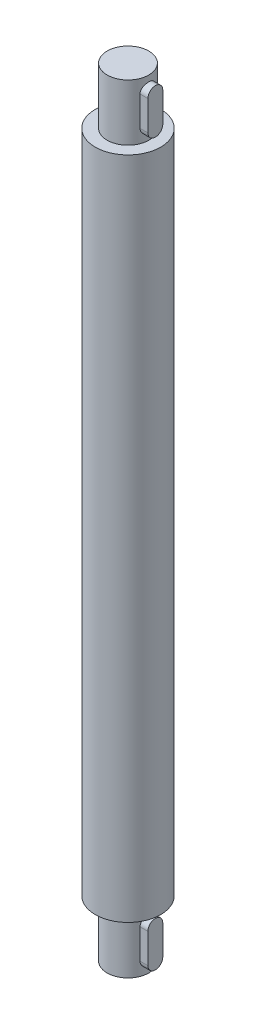
ISO-10303-21;
HEADER;
FILE_DESCRIPTION(('STEP AP214'),'2;1');
FILE_NAME('part.step','',(''),(''),'','','');
FILE_SCHEMA(('AUTOMOTIVE_DESIGN { 1 0 10303 214 1 1 1 1 }'));
ENDSEC;
DATA;
#1=APPLICATION_CONTEXT('core data for automotive mechanical design processes');
#2=APPLICATION_PROTOCOL_DEFINITION('international standard','automotive_design',2000,#1);
#3=PRODUCT_CONTEXT('',#1,'mechanical');
#4=PRODUCT('Part','Part','',(#3));
#5=PRODUCT_RELATED_PRODUCT_CATEGORY('part','',(#4));
#6=PRODUCT_DEFINITION_FORMATION('','',#4);
#7=PRODUCT_DEFINITION_CONTEXT('part definition',#1,'design');
#8=PRODUCT_DEFINITION('design','',#6,#7);
#9=PRODUCT_DEFINITION_SHAPE('','',#8);
#10=(LENGTH_UNIT() NAMED_UNIT(*) SI_UNIT(.MILLI.,.METRE.));
#11=(NAMED_UNIT(*) PLANE_ANGLE_UNIT() SI_UNIT($,.RADIAN.));
#12=(NAMED_UNIT(*) SI_UNIT($,.STERADIAN.) SOLID_ANGLE_UNIT());
#13=UNCERTAINTY_MEASURE_WITH_UNIT(LENGTH_MEASURE(1.E-05),#10,'distance_accuracy_value','');
#14=(GEOMETRIC_REPRESENTATION_CONTEXT(3) GLOBAL_UNCERTAINTY_ASSIGNED_CONTEXT((#13)) GLOBAL_UNIT_ASSIGNED_CONTEXT((#10,
#11,#12)) REPRESENTATION_CONTEXT('',''));
#15=CARTESIAN_POINT('',(0.,0.,0.));
#16=DIRECTION('',(0.,0.,1.));
#17=DIRECTION('',(1.,0.,0.));
#18=AXIS2_PLACEMENT_3D('',#15,#16,#17);
#19=CARTESIAN_POINT('',(0.,261.5,0.));
#20=DIRECTION('',(0.,-1.,0.));
#21=DIRECTION('',(0.,0.,-1.));
#22=AXIS2_PLACEMENT_3D('',#19,#20,#21);
#23=CYLINDRICAL_SURFACE('',#22,7.);
#24=CARTESIAN_POINT('',(0.,242.5,0.));
#25=DIRECTION('',(0.,1.,0.));
#26=DIRECTION('',(0.,0.,1.));
#27=AXIS2_PLACEMENT_3D('',#24,#25,#26);
#28=CIRCLE('',#27,7.);
#29=CARTESIAN_POINT('',(0.,242.5,7.));
#30=VERTEX_POINT('',#29);
#31=EDGE_CURVE('E182',#30,#30,#28,.T.);
#32=ORIENTED_EDGE('',*,*,#31,.T.);
#33=EDGE_LOOP('',(#32));
#34=FACE_BOUND('',#33,.T.);
#35=CARTESIAN_POINT('',(0.,261.5,0.));
#36=DIRECTION('',(0.,1.,0.));
#37=DIRECTION('',(0.,0.,1.));
#38=AXIS2_PLACEMENT_3D('',#35,#36,#37);
#39=CIRCLE('',#38,7.);
#40=CARTESIAN_POINT('',(0.,261.5,7.));
#41=VERTEX_POINT('',#40);
#42=EDGE_CURVE('E169',#41,#41,#39,.T.);
#43=ORIENTED_EDGE('',*,*,#42,.F.);
#44=EDGE_LOOP('',(#43));
#45=FACE_BOUND('',#44,.T.);
#46=CARTESIAN_POINT('',(6.53834841531101,257.,-2.5));
#47=CARTESIAN_POINT('',(6.53834584824662,257.135527062406,-2.50000293142537));
#48=CARTESIAN_POINT('',(6.54260813914497,257.271033863672,-2.48894249442902));
#49=CARTESIAN_POINT('',(6.55909115270697,257.537992919034,-2.44517096849283));
#50=CARTESIAN_POINT('',(6.57131226844034,257.669444972539,-2.41245881021844));
#51=CARTESIAN_POINT('',(6.60215581723148,257.924374759039,-2.32671186637104));
#52=CARTESIAN_POINT('',(6.62076416275495,258.047869336842,-2.27372177606196));
#53=CARTESIAN_POINT('',(6.66226377845015,258.284260868799,-2.14907922668039));
#54=CARTESIAN_POINT('',(6.6851561961377,258.397154971354,-2.07742176541368));
#55=CARTESIAN_POINT('',(6.73379932254783,258.61422119891,-1.91402447589219));
#56=CARTESIAN_POINT('',(6.75962863426195,258.717847862063,-1.82158324114033));
#57=CARTESIAN_POINT('',(6.81057580348322,258.908506848682,-1.62073451198081));
#58=CARTESIAN_POINT('',(6.83569352591561,258.995536039328,-1.51232401016044));
#59=CARTESIAN_POINT('',(6.88331097797525,259.153089086853,-1.27854087761782));
#60=CARTESIAN_POINT('',(6.90570766813104,259.22302949243,-1.1527521877025));
#61=CARTESIAN_POINT('',(6.94442306763788,259.340535055454,-0.890255063415771));
#62=CARTESIAN_POINT('',(6.96074367474991,259.388107200468,-0.753550054798998));
#63=CARTESIAN_POINT('',(6.98491061598651,259.4576409488,-0.478828726649231));
#64=CARTESIAN_POINT('',(6.99306609346167,259.480539560236,-0.341077285205235));
#65=CARTESIAN_POINT('',(7.00108797904843,259.503068389828,-0.063461721247977));
#66=CARTESIAN_POINT('',(7.0009568336799,259.502705475653,0.0764017655190215));
#67=CARTESIAN_POINT('',(6.99262260766838,259.479288802435,0.34759237349461));
#68=CARTESIAN_POINT('',(6.98478254135507,259.457255493618,0.479020651818617));
#69=CARTESIAN_POINT('',(6.96237851891868,259.392827148857,0.736174131701963));
#70=CARTESIAN_POINT('',(6.94781409330091,259.35043069115,0.861898934371431));
#71=CARTESIAN_POINT('',(6.91316507785891,259.245953084174,1.10616096680964));
#72=CARTESIAN_POINT('',(6.89300594264801,259.183604233005,1.22457268185844));
#73=CARTESIAN_POINT('',(6.84923357904068,259.041220859901,1.44953519587019));
#74=CARTESIAN_POINT('',(6.82561929883883,258.961180948701,1.55608236560639));
#75=CARTESIAN_POINT('',(6.77590353640075,258.780669224068,1.76033248031901));
#76=CARTESIAN_POINT('',(6.74973657984374,258.679333098067,1.85725678265595));
#77=CARTESIAN_POINT('',(6.69889962393308,258.461656512569,2.03301110882294));
#78=CARTESIAN_POINT('',(6.67422993264585,258.345312980545,2.11183741816387));
#79=CARTESIAN_POINT('',(6.62879124339514,258.09812234808,2.25045901136822));
#80=CARTESIAN_POINT('',(6.60810276493379,257.967046933587,2.30987563749328));
#81=CARTESIAN_POINT('',(6.57389739465231,257.695820548061,2.40551106572704));
#82=CARTESIAN_POINT('',(6.56037695532893,257.555674104941,2.44174134473283));
#83=CARTESIAN_POINT('',(6.54286005574887,257.277916114231,2.48828716066846));
#84=CARTESIAN_POINT('',(6.53841416370465,257.140538187322,2.49982704691603));
#85=CARTESIAN_POINT('',(6.53828418658321,256.865766624783,2.50016897842258));
#86=CARTESIAN_POINT('',(6.54259819175289,256.728372999106,2.48897597969826));
#87=CARTESIAN_POINT('',(6.55904904907212,256.463426225273,2.44527599545484));
#88=CARTESIAN_POINT('',(6.57085417549386,256.335701256423,2.41367185988824));
#89=CARTESIAN_POINT('',(6.60057618928644,256.087410085006,2.33115923950031));
#90=CARTESIAN_POINT('',(6.61849425677191,255.966845270001,2.28024702700688));
#91=CARTESIAN_POINT('',(6.65919897877473,255.731599822512,2.15854403482726));
#92=CARTESIAN_POINT('',(6.68213439822038,255.617274074217,2.08711845508962));
#93=CARTESIAN_POINT('',(6.7300229745037,255.401792279197,1.92711056207347));
#94=CARTESIAN_POINT('',(6.75497680677527,255.300640670817,1.83852249165401));
#95=CARTESIAN_POINT('',(6.8057956643971,255.108457310004,1.64077043500401));
#96=CARTESIAN_POINT('',(6.83163247928112,255.018320614537,1.53072651663182));
#97=CARTESIAN_POINT('',(6.8799372936983,254.857707314949,1.29643714363473));
#98=CARTESIAN_POINT('',(6.90240534953733,254.787230382215,1.17219192643335));
#99=CARTESIAN_POINT('',(6.94137984159746,254.668499776592,0.913380473926362));
#100=CARTESIAN_POINT('',(6.95791626179403,254.620133982539,0.778870439322916));
#101=CARTESIAN_POINT('',(6.98328335983111,254.546953140943,0.50290689892168));
#102=CARTESIAN_POINT('',(6.99211728252105,254.522128175912,0.361456343526398));
#103=CARTESIAN_POINT('',(7.0008038188261,254.497727033356,0.0837575092860639));
#104=CARTESIAN_POINT('',(7.00111065426498,254.496873893551,-0.0523654499559461));
#105=CARTESIAN_POINT('',(6.99386365091442,254.517215376987,-0.322726803691542));
#106=CARTESIAN_POINT('',(6.98631061639184,254.538407744405,-0.456965389580614));
#107=CARTESIAN_POINT('',(6.96438311073991,254.601360129296,-0.716981322330663));
#108=CARTESIAN_POINT('',(6.95015128080455,254.642690723368,-0.842875555999367));
#109=CARTESIAN_POINT('',(6.91633887698631,254.744333090731,-1.08597143426174));
#110=CARTESIAN_POINT('',(6.89675730094669,254.804648420714,-1.20317144494914));
#111=CARTESIAN_POINT('',(6.85325490485466,254.945311352324,-1.43068233807412));
#112=CARTESIAN_POINT('',(6.82919171160485,255.026364475099,-1.54052934900399));
#113=CARTESIAN_POINT('',(6.77971046047429,255.205052459192,-1.74546847276762));
#114=CARTESIAN_POINT('',(6.75429194159096,255.302692987583,-1.84055552155403));
#115=CARTESIAN_POINT('',(6.70352883842232,255.517218827174,-2.01782220864543));
#116=CARTESIAN_POINT('',(6.67824313001611,255.634789877419,-2.09919180205212));
#117=CARTESIAN_POINT('',(6.63200351602704,255.88273841431,-2.2410079881117));
#118=CARTESIAN_POINT('',(6.61104931825107,256.013115036248,-2.30145599226944));
#119=CARTESIAN_POINT('',(6.57609213229057,256.283740923839,-2.39953333207332));
#120=CARTESIAN_POINT('',(6.56211826403834,256.424028806379,-2.43706721874483));
#121=CARTESIAN_POINT('',(6.54325005921779,256.709553893531,-2.48729274825372));
#122=CARTESIAN_POINT('',(6.53835116581018,256.854788576864,-2.4999968591037));
#123=CARTESIAN_POINT('',(6.53834841531101,257.,-2.5));
#124=B_SPLINE_CURVE_WITH_KNOTS('',3,(#46,#47,#48,#49,#50,#51,#52,#53,#54,#55,#56,#57,#58,#59,
#60,#61,#62,#63,#64,#65,#66,#67,#68,#69,#70,#71,#72,#73,#74,#75,#76,#77,#78,#79,#80,#81,#82,#83,
#84,#85,#86,#87,#88,#89,#90,#91,#92,#93,#94,#95,#96,#97,#98,#99,#100,#101,#102,#103,#104,#105,
#106,#107,#108,#109,#110,#111,#112,#113,#114,#115,#116,#117,#118,#119,#120,#121,#122,#123),
.UNSPECIFIED.,.T.,.F.,(4,2,2,2,2,2,2,2,2,2,2,2,2,2,2,2,2,2,2,2,2,2,2,2,2,2,2,2,2,2,2,2,2,2,2,2,
2,2,4),(0.,0.406041766331056,0.812103587737005,1.2172755024313,1.62255610072686,
2.04441002530116,2.46634349733971,2.90112813694278,3.33577686482081,3.7532646023455,
4.17062908250823,4.56923737347852,4.9678734994849,5.37209971069692,5.77644923231499,
6.20244167773852,6.62852147719011,7.06247609308425,7.49621574141769,7.90789453596193,
8.31948358967597,8.71400941843626,9.10861145427955,9.5170588594573,9.92564351590601,
10.3573204832379,10.7889902346612,11.2184461110407,11.6477209819894,12.0540827015586,
12.4604028439598,12.8584146445104,13.2565010549614,13.6705301611801,14.084701005616,
14.5182116217955,14.9516929848591,15.386967912939,15.8220242160485),.UNSPECIFIED.);
#125=CARTESIAN_POINT('',(6.53834841531101,257.,-2.5));
#126=VERTEX_POINT('',#125);
#127=CARTESIAN_POINT('',(6.53834841531101,257.,2.5));
#128=VERTEX_POINT('',#127);
#129=EDGE_CURVE('E11',#126,#128,#124,.T.);
#130=ORIENTED_EDGE('',*,*,#129,.F.);
#131=DIRECTION('',(0.,-1.,0.));
#132=VECTOR('',#131,1.);
#133=CARTESIAN_POINT('',(6.53834841531101,261.5,-2.5));
#134=LINE('',#133,#132);
#135=CARTESIAN_POINT('',(6.53834841531101,247.,-2.5));
#136=VERTEX_POINT('',#135);
#137=EDGE_CURVE('E57',#136,#126,#134,.F.);
#138=ORIENTED_EDGE('',*,*,#137,.F.);
#139=CARTESIAN_POINT('',(6.53834841531101,247.,-2.5));
#140=CARTESIAN_POINT('',(6.53834584824662,247.135527062406,-2.50000293142537));
#141=CARTESIAN_POINT('',(6.54260813914497,247.271033863671,-2.48894249442903));
#142=CARTESIAN_POINT('',(6.55909115270696,247.537992919034,-2.44517096849285));
#143=CARTESIAN_POINT('',(6.57131226844033,247.669444972538,-2.41245881021846));
#144=CARTESIAN_POINT('',(6.60215581723147,247.924374759039,-2.32671186637107));
#145=CARTESIAN_POINT('',(6.62076416275494,248.047869336842,-2.27372177606199));
#146=CARTESIAN_POINT('',(6.66226377845014,248.284260868799,-2.14907922668042));
#147=CARTESIAN_POINT('',(6.68515619613769,248.397154971354,-2.0774217654137));
#148=CARTESIAN_POINT('',(6.73379932254782,248.61422119891,-1.91402447589222));
#149=CARTESIAN_POINT('',(6.75962863426194,248.717847862063,-1.82158324114036));
#150=CARTESIAN_POINT('',(6.81057580348321,248.908506848682,-1.62073451198085));
#151=CARTESIAN_POINT('',(6.8356935259156,248.995536039328,-1.51232401016049));
#152=CARTESIAN_POINT('',(6.88331097797524,249.153089086853,-1.27854087761788));
#153=CARTESIAN_POINT('',(6.90570766813103,249.22302949243,-1.15275218770256));
#154=CARTESIAN_POINT('',(6.94442306763787,249.340535055454,-0.890255063415846));
#155=CARTESIAN_POINT('',(6.9607436747499,249.388107200468,-0.753550054799079));
#156=CARTESIAN_POINT('',(6.98491061598651,249.4576409488,-0.478828726649319));
#157=CARTESIAN_POINT('',(6.99306609346167,249.480539560235,-0.341077285205325));
#158=CARTESIAN_POINT('',(7.00108797904843,249.503068389828,-0.0634617212480675));
#159=CARTESIAN_POINT('',(7.0009568336799,249.502705475653,0.0764017655189323));
#160=CARTESIAN_POINT('',(6.99262260766838,249.479288802435,0.347592373494527));
#161=CARTESIAN_POINT('',(6.98478254135507,249.457255493618,0.479020651818539));
#162=CARTESIAN_POINT('',(6.96237851891869,249.392827148857,0.73617413170189));
#163=CARTESIAN_POINT('',(6.94781409330092,249.35043069115,0.86189893437136));
#164=CARTESIAN_POINT('',(6.91316507785892,249.245953084174,1.10616096680956));
#165=CARTESIAN_POINT('',(6.89300594264802,249.183604233006,1.22457268185836));
#166=CARTESIAN_POINT('',(6.8492335790407,249.041220859901,1.44953519587011));
#167=CARTESIAN_POINT('',(6.82561929883885,248.961180948701,1.55608236560631));
#168=CARTESIAN_POINT('',(6.77590353640077,248.780669224068,1.76033248031895));
#169=CARTESIAN_POINT('',(6.74973657984375,248.679333098067,1.8572567826559));
#170=CARTESIAN_POINT('',(6.6988996239331,248.461656512569,2.0330111088229));
#171=CARTESIAN_POINT('',(6.67422993264587,248.345312980545,2.11183741816383));
#172=CARTESIAN_POINT('',(6.62879124339515,248.09812234808,2.25045901136818));
#173=CARTESIAN_POINT('',(6.6081027649338,247.967046933587,2.30987563749325));
#174=CARTESIAN_POINT('',(6.57389739465232,247.695820548061,2.40551106572702));
#175=CARTESIAN_POINT('',(6.56037695532894,247.555674104941,2.44174134473281));
#176=CARTESIAN_POINT('',(6.54286005574888,247.277916114231,2.48828716066845));
#177=CARTESIAN_POINT('',(6.53841416370465,247.140538187322,2.49982704691603));
#178=CARTESIAN_POINT('',(6.53828418658321,246.865766624783,2.50016897842259));
#179=CARTESIAN_POINT('',(6.54259819175289,246.728372999106,2.48897597969827));
#180=CARTESIAN_POINT('',(6.55904904907211,246.463426225273,2.44527599545486));
#181=CARTESIAN_POINT('',(6.57085417549385,246.335701256423,2.41367185988827));
#182=CARTESIAN_POINT('',(6.60057618928643,246.087410085006,2.33115923950035));
#183=CARTESIAN_POINT('',(6.6184942567719,245.966845270001,2.28024702700691));
#184=CARTESIAN_POINT('',(6.65919897877472,245.731599822512,2.15854403482729));
#185=CARTESIAN_POINT('',(6.68213439822037,245.617274074217,2.08711845508965));
#186=CARTESIAN_POINT('',(6.73002297450369,245.401792279197,1.92711056207352));
#187=CARTESIAN_POINT('',(6.75497680677526,245.300640670817,1.83852249165407));
#188=CARTESIAN_POINT('',(6.80579566439709,245.108457310004,1.64077043500406));
#189=CARTESIAN_POINT('',(6.83163247928111,245.018320614537,1.53072651663186));
#190=CARTESIAN_POINT('',(6.87993729369829,244.857707314949,1.29643714363478));
#191=CARTESIAN_POINT('',(6.90240534953732,244.787230382215,1.17219192643341));
#192=CARTESIAN_POINT('',(6.94137984159745,244.668499776592,0.913380473926433));
#193=CARTESIAN_POINT('',(6.95791626179403,244.620133982539,0.778870439322982));
#194=CARTESIAN_POINT('',(6.9832833598311,244.546953140943,0.502906898921749));
#195=CARTESIAN_POINT('',(6.99211728252105,244.522128175912,0.361456343526476));
#196=CARTESIAN_POINT('',(7.0008038188261,244.497727033356,0.0837575092861523));
#197=CARTESIAN_POINT('',(7.00111065426498,244.496873893551,-0.0523654499558566));
#198=CARTESIAN_POINT('',(6.99386365091442,244.517215376987,-0.322726803691456));
#199=CARTESIAN_POINT('',(6.98631061639185,244.538407744404,-0.456965389580533));
#200=CARTESIAN_POINT('',(6.96438311073992,244.601360129296,-0.716981322330577));
#201=CARTESIAN_POINT('',(6.95015128080457,244.642690723368,-0.842875555999272));
#202=CARTESIAN_POINT('',(6.91633887698632,244.744333090731,-1.08597143426165));
#203=CARTESIAN_POINT('',(6.8967573009467,244.804648420714,-1.20317144494907));
#204=CARTESIAN_POINT('',(6.85325490485468,244.945311352324,-1.43068233807406));
#205=CARTESIAN_POINT('',(6.82919171160486,245.026364475098,-1.54052934900392));
#206=CARTESIAN_POINT('',(6.77971046047431,245.205052459192,-1.74546847276756));
#207=CARTESIAN_POINT('',(6.75429194159098,245.302692987583,-1.84055552155398));
#208=CARTESIAN_POINT('',(6.70352883842234,245.517218827174,-2.01782220864537));
#209=CARTESIAN_POINT('',(6.67824313001613,245.634789877419,-2.09919180205206));
#210=CARTESIAN_POINT('',(6.63200351602706,245.88273841431,-2.24100798811164));
#211=CARTESIAN_POINT('',(6.61104931825108,246.013115036248,-2.3014559922694));
#212=CARTESIAN_POINT('',(6.57609213229058,246.283740923839,-2.39953333207331));
#213=CARTESIAN_POINT('',(6.56211826403834,246.424028806379,-2.43706721874482));
#214=CARTESIAN_POINT('',(6.54325005921779,246.709553893531,-2.48729274825372));
#215=CARTESIAN_POINT('',(6.53835116581018,246.854788576864,-2.4999968591037));
#216=CARTESIAN_POINT('',(6.53834841531101,247.,-2.5));
#217=B_SPLINE_CURVE_WITH_KNOTS('',3,(#139,#140,#141,#142,#143,#144,#145,#146,#147,#148,#149,
#150,#151,#152,#153,#154,#155,#156,#157,#158,#159,#160,#161,#162,#163,#164,#165,#166,#167,#168,
#169,#170,#171,#172,#173,#174,#175,#176,#177,#178,#179,#180,#181,#182,#183,#184,#185,#186,#187,
#188,#189,#190,#191,#192,#193,#194,#195,#196,#197,#198,#199,#200,#201,#202,#203,#204,#205,#206,
#207,#208,#209,#210,#211,#212,#213,#214,#215,#216),.UNSPECIFIED.,.T.,.F.,(4,2,2,2,2,2,2,2,2,2,2,
2,2,2,2,2,2,2,2,2,2,2,2,2,2,2,2,2,2,2,2,2,2,2,2,2,2,2,4),(0.,0.406041766330971,
0.812103587736946,1.21727550243124,1.6225561007268,2.04441002530115,2.46634349733962,
2.90112813694271,3.33577686482071,3.7532646023454,4.17062908250814,4.56923737347844,
4.96787349948481,5.3720997106968,5.7764492323149,6.20244167773845,6.62852147719,
7.06247609308414,7.49621574141758,7.90789453596189,8.31948358967582,8.71400941843613,
9.1086114542795,9.51705885945718,9.92564351590594,10.3573204832378,10.7889902346611,
11.2184461110406,11.6477209819893,12.0540827015585,12.4604028439596,12.8584146445103,
13.2565010549613,13.67053016118,14.0847010056159,14.5182116217953,14.951692984859,
15.3869679129389,15.8220242160484),.UNSPECIFIED.);
#218=CARTESIAN_POINT('',(6.53834841531101,247.,2.5));
#219=VERTEX_POINT('',#218);
#220=EDGE_CURVE('E244',#219,#136,#217,.T.);
#221=ORIENTED_EDGE('',*,*,#220,.F.);
#222=DIRECTION('',(0.,-1.,0.));
#223=VECTOR('',#222,1.);
#224=CARTESIAN_POINT('',(6.53834841531101,261.5,2.5));
#225=LINE('',#224,#223);
#226=EDGE_CURVE('E241',#128,#219,#225,.T.);
#227=ORIENTED_EDGE('',*,*,#226,.F.);
#228=EDGE_LOOP('',(#130,#138,#221,#227));
#229=FACE_BOUND('',#228,.T.);
#230=ADVANCED_FACE('F42',(#34,#45,#229),#23,.T.);
#231=CARTESIAN_POINT('',(0.,19.,0.));
#232=DIRECTION('',(0.,-1.,0.));
#233=DIRECTION('',(0.,0.,-1.));
#234=AXIS2_PLACEMENT_3D('',#231,#232,#233);
#235=CYLINDRICAL_SURFACE('',#234,7.);
#236=DIRECTION('',(0.,-1.,0.));
#237=VECTOR('',#236,1.);
#238=CARTESIAN_POINT('',(6.53834841531101,19.,-2.5));
#239=LINE('',#238,#237);
#240=CARTESIAN_POINT('',(6.53834841531101,14.5,-2.5));
#241=VERTEX_POINT('',#240);
#242=CARTESIAN_POINT('',(6.53834841531101,4.5,-2.5));
#243=VERTEX_POINT('',#242);
#244=EDGE_CURVE('E186',#241,#243,#239,.T.);
#245=ORIENTED_EDGE('',*,*,#244,.T.);
#246=CARTESIAN_POINT('',(6.53834841531101,4.5,-2.5));
#247=CARTESIAN_POINT('',(6.53834584824662,4.36447293759434,-2.50000293142537));
#248=CARTESIAN_POINT('',(6.54260813914497,4.22896613632854,-2.48894249442902));
#249=CARTESIAN_POINT('',(6.55909115270697,3.96200708096645,-2.44517096849284));
#250=CARTESIAN_POINT('',(6.57131226844033,3.83055502746152,-2.41245881021845));
#251=CARTESIAN_POINT('',(6.60215581723148,3.57562524096083,-2.32671186637106));
#252=CARTESIAN_POINT('',(6.62076416275494,3.45213066315779,-2.27372177606199));
#253=CARTESIAN_POINT('',(6.66226377845014,3.21573913120065,-2.14907922668041));
#254=CARTESIAN_POINT('',(6.68515619613769,3.10284502864644,-2.0774217654137));
#255=CARTESIAN_POINT('',(6.73379932254782,2.88577880109018,-1.91402447589221));
#256=CARTESIAN_POINT('',(6.75962863426194,2.78215213793684,-1.82158324114035));
#257=CARTESIAN_POINT('',(6.81057580348321,2.59149315131818,-1.62073451198083));
#258=CARTESIAN_POINT('',(6.8356935259156,2.50446396067198,-1.51232401016048));
#259=CARTESIAN_POINT('',(6.88331097797524,2.34691091314746,-1.27854087761788));
#260=CARTESIAN_POINT('',(6.90570766813103,2.27697050756982,-1.15275218770255));
#261=CARTESIAN_POINT('',(6.94442306763787,2.15946494454605,-0.890255063415834));
#262=CARTESIAN_POINT('',(6.9607436747499,2.11189279953219,-0.753550054799064));
#263=CARTESIAN_POINT('',(6.98491061598651,2.04235905119993,-0.478828726649302));
#264=CARTESIAN_POINT('',(6.99306609346167,2.01946043976448,-0.341077285205309));
#265=CARTESIAN_POINT('',(7.00108797904843,1.9969316101723,-0.063461721248052));
#266=CARTESIAN_POINT('',(7.0009568336799,1.99729452434681,0.0764017655189463));
#267=CARTESIAN_POINT('',(6.99262260766838,2.0207111975646,0.347592373494542));
#268=CARTESIAN_POINT('',(6.98478254135507,2.0427445063821,0.479020651818556));
#269=CARTESIAN_POINT('',(6.96237851891869,2.1071728511432,0.736174131701907));
#270=CARTESIAN_POINT('',(6.94781409330092,2.14956930884995,0.861898934371374));
#271=CARTESIAN_POINT('',(6.91316507785892,2.25404691582561,1.10616096680958));
#272=CARTESIAN_POINT('',(6.89300594264802,2.31639576699443,1.22457268185839));
#273=CARTESIAN_POINT('',(6.84923357904069,2.4587791400987,1.44953519587014));
#274=CARTESIAN_POINT('',(6.82561929883884,2.53881905129852,1.55608236560633));
#275=CARTESIAN_POINT('',(6.77590353640076,2.71933077593156,1.76033248031897));
#276=CARTESIAN_POINT('',(6.74973657984375,2.82066690193269,1.85725678265592));
#277=CARTESIAN_POINT('',(6.69889962393309,3.03834348743058,2.03301110882291));
#278=CARTESIAN_POINT('',(6.67422993264586,3.15468701945543,2.11183741816384));
#279=CARTESIAN_POINT('',(6.62879124339514,3.40187765191961,2.25045901136819));
#280=CARTESIAN_POINT('',(6.6081027649338,3.53295306641328,2.30987563749326));
#281=CARTESIAN_POINT('',(6.57389739465231,3.804179451939,2.40551106572703));
#282=CARTESIAN_POINT('',(6.56037695532894,3.94432589505924,2.44174134473282));
#283=CARTESIAN_POINT('',(6.54286005574888,4.22208388576867,2.48828716066845));
#284=CARTESIAN_POINT('',(6.53841416370465,4.359461812678,2.49982704691603));
#285=CARTESIAN_POINT('',(6.53828418658321,4.63423337521672,2.50016897842258));
#286=CARTESIAN_POINT('',(6.54259819175289,4.77162700089379,2.48897597969827));
#287=CARTESIAN_POINT('',(6.55904904907211,5.03657377472731,2.44527599545485));
#288=CARTESIAN_POINT('',(6.57085417549385,5.16429874357693,2.41367185988826));
#289=CARTESIAN_POINT('',(6.60057618928644,5.41258991499362,2.33115923950034));
#290=CARTESIAN_POINT('',(6.6184942567719,5.53315472999922,2.2802470270069));
#291=CARTESIAN_POINT('',(6.65919897877472,5.76840017748808,2.15854403482729));
#292=CARTESIAN_POINT('',(6.68213439822037,5.88272592578259,2.08711845508965));
#293=CARTESIAN_POINT('',(6.73002297450369,6.09820772080303,1.92711056207351));
#294=CARTESIAN_POINT('',(6.75497680677526,6.19935932918255,1.83852249165407));
#295=CARTESIAN_POINT('',(6.80579566439709,6.39154268999623,1.64077043500406));
#296=CARTESIAN_POINT('',(6.83163247928111,6.48167938546273,1.53072651663186));
#297=CARTESIAN_POINT('',(6.87993729369829,6.64229268505071,1.29643714363478));
#298=CARTESIAN_POINT('',(6.90240534953732,6.71276961778492,1.1721919264334));
#299=CARTESIAN_POINT('',(6.94137984159745,6.83150022340817,0.913380473926429));
#300=CARTESIAN_POINT('',(6.95791626179403,6.87986601746067,0.778870439322977));
#301=CARTESIAN_POINT('',(6.9832833598311,6.95304685905716,0.502906898921739));
#302=CARTESIAN_POINT('',(6.99211728252105,6.97787182408849,0.361456343526464));
#303=CARTESIAN_POINT('',(7.0008038188261,7.00227296664433,0.0837575092861364));
#304=CARTESIAN_POINT('',(7.00111065426498,7.00312610644893,-0.0523654499558732));
#305=CARTESIAN_POINT('',(6.99386365091442,6.98278462301327,-0.322726803691473));
#306=CARTESIAN_POINT('',(6.98631061639184,6.96159225559553,-0.456965389580549));
#307=CARTESIAN_POINT('',(6.96438311073992,6.89863987070442,-0.716981322330597));
#308=CARTESIAN_POINT('',(6.95015128080456,6.85730927663153,-0.842875555999297));
#309=CARTESIAN_POINT('',(6.91633887698632,6.75566690926909,-1.08597143426168));
#310=CARTESIAN_POINT('',(6.8967573009467,6.69535157928641,-1.20317144494909));
#311=CARTESIAN_POINT('',(6.85325490485467,6.55468864767617,-1.43068233807408));
#312=CARTESIAN_POINT('',(6.82919171160486,6.47363552490154,-1.54052934900393));
#313=CARTESIAN_POINT('',(6.77971046047431,6.29494754080834,-1.74546847276757));
#314=CARTESIAN_POINT('',(6.75429194159098,6.19730701241678,-1.84055552155398));
#315=CARTESIAN_POINT('',(6.70352883842234,5.98278117282576,-2.01782220864538));
#316=CARTESIAN_POINT('',(6.67824313001613,5.86521012258063,-2.09919180205207));
#317=CARTESIAN_POINT('',(6.63200351602705,5.61726158568968,-2.24100798811166));
#318=CARTESIAN_POINT('',(6.61104931825108,5.48688496375221,-2.30145599226941));
#319=CARTESIAN_POINT('',(6.57609213229057,5.21625907616111,-2.39953333207331));
#320=CARTESIAN_POINT('',(6.56211826403834,5.07597119362146,-2.43706721874483));
#321=CARTESIAN_POINT('',(6.54325005921779,4.79044610646854,-2.48729274825372));
#322=CARTESIAN_POINT('',(6.53835116581018,4.64521142313578,-2.4999968591037));
#323=CARTESIAN_POINT('',(6.53834841531101,4.5,-2.5));
#324=B_SPLINE_CURVE_WITH_KNOTS('',3,(#246,#247,#248,#249,#250,#251,#252,#253,#254,#255,#256,
#257,#258,#259,#260,#261,#262,#263,#264,#265,#266,#267,#268,#269,#270,#271,#272,#273,#274,#275,
#276,#277,#278,#279,#280,#281,#282,#283,#284,#285,#286,#287,#288,#289,#290,#291,#292,#293,#294,
#295,#296,#297,#298,#299,#300,#301,#302,#303,#304,#305,#306,#307,#308,#309,#310,#311,#312,#313,
#314,#315,#316,#317,#318,#319,#320,#321,#322,#323),.UNSPECIFIED.,.T.,.F.,(4,2,2,2,2,2,2,2,2,2,2,
2,2,2,2,2,2,2,2,2,2,2,2,2,2,2,2,2,2,2,2,2,2,2,2,2,2,2,4),(0.,0.406041766331,0.812103587736961,
1.21727550243125,1.62255610072681,2.04441002530116,2.46634349733964,2.90112813694272,
3.33577686482073,3.75326460234542,4.17062908250815,4.56923737347846,4.96787349948484,
5.37209971069683,5.77644923231493,6.20244167773848,6.62852147719004,7.06247609308417,
7.4962157414176,7.90789453596191,8.31948358967585,8.71400941843618,9.10861145427952,
9.5170588594572,9.92564351590594,10.3573204832378,10.7889902346612,11.2184461110406,
11.6477209819893,12.0540827015585,12.4604028439597,12.8584146445103,13.2565010549614,
13.67053016118,14.0847010056159,14.5182116217954,14.9516929848591,15.386967912939,
15.8220242160484),.UNSPECIFIED.);
#325=CARTESIAN_POINT('',(6.53834841531101,4.5,2.5));
#326=VERTEX_POINT('',#325);
#327=EDGE_CURVE('E234',#243,#326,#324,.T.);
#328=ORIENTED_EDGE('',*,*,#327,.T.);
#329=DIRECTION('',(0.,-1.,0.));
#330=VECTOR('',#329,1.);
#331=CARTESIAN_POINT('',(6.53834841531101,19.,2.5));
#332=LINE('',#331,#330);
#333=CARTESIAN_POINT('',(6.53834841531101,14.5,2.5));
#334=VERTEX_POINT('',#333);
#335=EDGE_CURVE('E213',#326,#334,#332,.F.);
#336=ORIENTED_EDGE('',*,*,#335,.T.);
#337=CARTESIAN_POINT('',(6.53834841531101,14.5,-2.5));
#338=CARTESIAN_POINT('',(6.53834584824662,14.3644729375943,-2.50000293142537));
#339=CARTESIAN_POINT('',(6.54260813914497,14.2289661363285,-2.48894249442902));
#340=CARTESIAN_POINT('',(6.55909115270697,13.9620070809665,-2.44517096849284));
#341=CARTESIAN_POINT('',(6.57131226844033,13.8305550274615,-2.41245881021845));
#342=CARTESIAN_POINT('',(6.60215581723148,13.5756252409608,-2.32671186637106));
#343=CARTESIAN_POINT('',(6.62076416275494,13.4521306631578,-2.27372177606199));
#344=CARTESIAN_POINT('',(6.66226377845014,13.2157391312006,-2.14907922668041));
#345=CARTESIAN_POINT('',(6.68515619613769,13.1028450286464,-2.0774217654137));
#346=CARTESIAN_POINT('',(6.73379932254782,12.8857788010902,-1.91402447589221));
#347=CARTESIAN_POINT('',(6.75962863426194,12.7821521379368,-1.82158324114035));
#348=CARTESIAN_POINT('',(6.81057580348321,12.5914931513182,-1.62073451198083));
#349=CARTESIAN_POINT('',(6.8356935259156,12.504463960672,-1.51232401016048));
#350=CARTESIAN_POINT('',(6.88331097797524,12.3469109131475,-1.27854087761788));
#351=CARTESIAN_POINT('',(6.90570766813103,12.2769705075698,-1.15275218770255));
#352=CARTESIAN_POINT('',(6.94442306763787,12.1594649445461,-0.890255063415834));
#353=CARTESIAN_POINT('',(6.9607436747499,12.1118927995322,-0.753550054799064));
#354=CARTESIAN_POINT('',(6.98491061598651,12.0423590511999,-0.478828726649303));
#355=CARTESIAN_POINT('',(6.99306609346167,12.0194604397645,-0.341077285205309));
#356=CARTESIAN_POINT('',(7.00108797904843,11.9969316101723,-0.0634617212480525));
#357=CARTESIAN_POINT('',(7.0009568336799,11.9972945243468,0.0764017655189459));
#358=CARTESIAN_POINT('',(6.99262260766838,12.0207111975646,0.347592373494541));
#359=CARTESIAN_POINT('',(6.98478254135507,12.0427445063821,0.479020651818555));
#360=CARTESIAN_POINT('',(6.96237851891869,12.1071728511432,0.736174131701906));
#361=CARTESIAN_POINT('',(6.94781409330092,12.1495693088499,0.861898934371373));
#362=CARTESIAN_POINT('',(6.91316507785892,12.2540469158256,1.10616096680958));
#363=CARTESIAN_POINT('',(6.89300594264802,12.3163957669944,1.22457268185839));
#364=CARTESIAN_POINT('',(6.84923357904069,12.4587791400987,1.44953519587014));
#365=CARTESIAN_POINT('',(6.82561929883884,12.5388190512985,1.55608236560633));
#366=CARTESIAN_POINT('',(6.77590353640076,12.7193307759316,1.76033248031897));
#367=CARTESIAN_POINT('',(6.74973657984375,12.8206669019327,1.85725678265592));
#368=CARTESIAN_POINT('',(6.69889962393309,13.0383434874306,2.03301110882291));
#369=CARTESIAN_POINT('',(6.67422993264586,13.1546870194554,2.11183741816384));
#370=CARTESIAN_POINT('',(6.62879124339515,13.4018776519196,2.25045901136819));
#371=CARTESIAN_POINT('',(6.6081027649338,13.5329530664133,2.30987563749326));
#372=CARTESIAN_POINT('',(6.57389739465231,13.804179451939,2.40551106572703));
#373=CARTESIAN_POINT('',(6.56037695532894,13.9443258950592,2.44174134473282));
#374=CARTESIAN_POINT('',(6.54286005574888,14.2220838857687,2.48828716066845));
#375=CARTESIAN_POINT('',(6.53841416370465,14.359461812678,2.49982704691603));
#376=CARTESIAN_POINT('',(6.53828418658321,14.6342333752167,2.50016897842258));
#377=CARTESIAN_POINT('',(6.54259819175289,14.7716270008938,2.48897597969827));
#378=CARTESIAN_POINT('',(6.55904904907211,15.0365737747273,2.44527599545485));
#379=CARTESIAN_POINT('',(6.57085417549385,15.1642987435769,2.41367185988826));
#380=CARTESIAN_POINT('',(6.60057618928644,15.4125899149936,2.33115923950034));
#381=CARTESIAN_POINT('',(6.6184942567719,15.5331547299992,2.2802470270069));
#382=CARTESIAN_POINT('',(6.65919897877472,15.7684001774881,2.15854403482729));
#383=CARTESIAN_POINT('',(6.68213439822037,15.8827259257826,2.08711845508965));
#384=CARTESIAN_POINT('',(6.73002297450369,16.098207720803,1.92711056207351));
#385=CARTESIAN_POINT('',(6.75497680677526,16.1993593291825,1.83852249165407));
#386=CARTESIAN_POINT('',(6.80579566439709,16.3915426899962,1.64077043500406));
#387=CARTESIAN_POINT('',(6.83163247928111,16.4816793854627,1.53072651663186));
#388=CARTESIAN_POINT('',(6.87993729369829,16.6422926850507,1.29643714363478));
#389=CARTESIAN_POINT('',(6.90240534953732,16.7127696177849,1.1721919264334));
#390=CARTESIAN_POINT('',(6.94137984159745,16.8315002234082,0.913380473926429));
#391=CARTESIAN_POINT('',(6.95791626179403,16.8798660174607,0.778870439322976));
#392=CARTESIAN_POINT('',(6.9832833598311,16.9530468590572,0.502906898921739));
#393=CARTESIAN_POINT('',(6.99211728252105,16.9778718240885,0.361456343526463));
#394=CARTESIAN_POINT('',(7.0008038188261,17.0022729666443,0.0837575092861354));
#395=CARTESIAN_POINT('',(7.00111065426498,17.0031261064489,-0.0523654499558744));
#396=CARTESIAN_POINT('',(6.99386365091442,16.9827846230133,-0.322726803691474));
#397=CARTESIAN_POINT('',(6.98631061639184,16.9615922555955,-0.456965389580549));
#398=CARTESIAN_POINT('',(6.96438311073992,16.8986398707044,-0.716981322330597));
#399=CARTESIAN_POINT('',(6.95015128080456,16.8573092766315,-0.842875555999297));
#400=CARTESIAN_POINT('',(6.91633887698632,16.7556669092691,-1.08597143426168));
#401=CARTESIAN_POINT('',(6.8967573009467,16.6953515792864,-1.20317144494909));
#402=CARTESIAN_POINT('',(6.85325490485467,16.5546886476762,-1.43068233807407));
#403=CARTESIAN_POINT('',(6.82919171160486,16.4736355249015,-1.54052934900393));
#404=CARTESIAN_POINT('',(6.77971046047431,16.2949475408083,-1.74546847276756));
#405=CARTESIAN_POINT('',(6.75429194159098,16.1973070124168,-1.84055552155398));
#406=CARTESIAN_POINT('',(6.70352883842234,15.9827811728258,-2.01782220864538));
#407=CARTESIAN_POINT('',(6.67824313001613,15.8652101225806,-2.09919180205207));
#408=CARTESIAN_POINT('',(6.63200351602705,15.6172615856897,-2.24100798811166));
#409=CARTESIAN_POINT('',(6.61104931825108,15.4868849637522,-2.30145599226941));
#410=CARTESIAN_POINT('',(6.57609213229057,15.2162590761611,-2.39953333207331));
#411=CARTESIAN_POINT('',(6.56211826403834,15.0759711936215,-2.43706721874482));
#412=CARTESIAN_POINT('',(6.54325005921779,14.7904461064685,-2.48729274825372));
#413=CARTESIAN_POINT('',(6.53835116581018,14.6452114231358,-2.4999968591037));
#414=CARTESIAN_POINT('',(6.53834841531101,14.5,-2.5));
#415=B_SPLINE_CURVE_WITH_KNOTS('',3,(#337,#338,#339,#340,#341,#342,#343,#344,#345,#346,#347,
#348,#349,#350,#351,#352,#353,#354,#355,#356,#357,#358,#359,#360,#361,#362,#363,#364,#365,#366,
#367,#368,#369,#370,#371,#372,#373,#374,#375,#376,#377,#378,#379,#380,#381,#382,#383,#384,#385,
#386,#387,#388,#389,#390,#391,#392,#393,#394,#395,#396,#397,#398,#399,#400,#401,#402,#403,#404,
#405,#406,#407,#408,#409,#410,#411,#412,#413,#414),.UNSPECIFIED.,.T.,.F.,(4,2,2,2,2,2,2,2,2,2,2,
2,2,2,2,2,2,2,2,2,2,2,2,2,2,2,2,2,2,2,2,2,2,2,2,2,2,2,4),(0.,0.406041766331001,
0.812103587736961,1.21727550243125,1.62255610072681,2.04441002530116,2.46634349733964,
2.90112813694272,3.33577686482073,3.75326460234542,4.17062908250815,4.56923737347846,
4.96787349948484,5.37209971069683,5.77644923231493,6.20244167773848,6.62852147719004,
7.06247609308417,7.4962157414176,7.90789453596191,8.31948358967585,8.71400941843618,
9.10861145427952,9.5170588594572,9.92564351590594,10.3573204832378,10.7889902346612,
11.2184461110406,11.6477209819893,12.0540827015585,12.4604028439597,12.8584146445103,
13.2565010549614,13.67053016118,14.0847010056159,14.5182116217954,14.9516929848591,
15.386967912939,15.8220242160484),.UNSPECIFIED.);
#416=EDGE_CURVE('E205',#334,#241,#415,.T.);
#417=ORIENTED_EDGE('',*,*,#416,.T.);
#418=EDGE_LOOP('',(#245,#328,#336,#417));
#419=FACE_BOUND('',#418,.T.);
#420=CARTESIAN_POINT('',(0.,19.,0.));
#421=DIRECTION('',(0.,1.,0.));
#422=DIRECTION('',(0.,0.,1.));
#423=AXIS2_PLACEMENT_3D('',#420,#421,#422);
#424=CIRCLE('',#423,7.);
#425=CARTESIAN_POINT('',(0.,19.,7.));
#426=VERTEX_POINT('',#425);
#427=EDGE_CURVE('E187',#426,#426,#424,.T.);
#428=ORIENTED_EDGE('',*,*,#427,.F.);
#429=EDGE_LOOP('',(#428));
#430=FACE_BOUND('',#429,.T.);
#431=CARTESIAN_POINT('',(0.,0.,0.));
#432=DIRECTION('',(0.,1.,0.));
#433=DIRECTION('',(0.,0.,1.));
#434=AXIS2_PLACEMENT_3D('',#431,#432,#433);
#435=CIRCLE('',#434,7.);
#436=CARTESIAN_POINT('',(0.,0.,7.));
#437=VERTEX_POINT('',#436);
#438=EDGE_CURVE('E192',#437,#437,#435,.T.);
#439=ORIENTED_EDGE('',*,*,#438,.T.);
#440=EDGE_LOOP('',(#439));
#441=FACE_BOUND('',#440,.T.);
#442=ADVANCED_FACE('F44',(#419,#430,#441),#235,.T.);
#443=CARTESIAN_POINT('',(0.,0.,0.));
#444=DIRECTION('',(0.,1.,0.));
#445=DIRECTION('',(0.,0.,1.));
#446=AXIS2_PLACEMENT_3D('',#443,#444,#445);
#447=PLANE('',#446);
#448=ORIENTED_EDGE('',*,*,#438,.F.);
#449=EDGE_LOOP('',(#448));
#450=FACE_BOUND('',#449,.T.);
#451=ADVANCED_FACE('F272',(#450),#447,.F.);
#452=CARTESIAN_POINT('',(0.,242.5,0.));
#453=DIRECTION('',(0.,-1.,0.));
#454=DIRECTION('',(0.,0.,-1.));
#455=AXIS2_PLACEMENT_3D('',#452,#453,#454);
#456=CYLINDRICAL_SURFACE('',#455,11.);
#457=CARTESIAN_POINT('',(0.,242.5,0.));
#458=DIRECTION('',(0.,1.,0.));
#459=DIRECTION('',(0.,0.,1.));
#460=AXIS2_PLACEMENT_3D('',#457,#458,#459);
#461=CIRCLE('',#460,11.);
#462=CARTESIAN_POINT('',(0.,242.5,11.));
#463=VERTEX_POINT('',#462);
#464=EDGE_CURVE('E188',#463,#463,#461,.T.);
#465=ORIENTED_EDGE('',*,*,#464,.F.);
#466=EDGE_LOOP('',(#465));
#467=FACE_BOUND('',#466,.T.);
#468=CARTESIAN_POINT('',(0.,19.,0.));
#469=DIRECTION('',(0.,1.,0.));
#470=DIRECTION('',(0.,0.,1.));
#471=AXIS2_PLACEMENT_3D('',#468,#469,#470);
#472=CIRCLE('',#471,11.);
#473=CARTESIAN_POINT('',(0.,19.,11.));
#474=VERTEX_POINT('',#473);
#475=EDGE_CURVE('E181',#474,#474,#472,.T.);
#476=ORIENTED_EDGE('',*,*,#475,.T.);
#477=EDGE_LOOP('',(#476));
#478=FACE_BOUND('',#477,.T.);
#479=ADVANCED_FACE('F289',(#467,#478),#456,.T.);
#480=CARTESIAN_POINT('',(0.,242.5,0.));
#481=DIRECTION('',(0.,1.,0.));
#482=DIRECTION('',(0.,0.,1.));
#483=AXIS2_PLACEMENT_3D('',#480,#481,#482);
#484=PLANE('',#483);
#485=ORIENTED_EDGE('',*,*,#31,.F.);
#486=EDGE_LOOP('',(#485));
#487=FACE_BOUND('',#486,.T.);
#488=ORIENTED_EDGE('',*,*,#464,.T.);
#489=EDGE_LOOP('',(#488));
#490=FACE_BOUND('',#489,.T.);
#491=ADVANCED_FACE('F283',(#487,#490),#484,.T.);
#492=CARTESIAN_POINT('',(0.,19.,0.));
#493=DIRECTION('',(0.,1.,0.));
#494=DIRECTION('',(0.,0.,1.));
#495=AXIS2_PLACEMENT_3D('',#492,#493,#494);
#496=PLANE('',#495);
#497=ORIENTED_EDGE('',*,*,#427,.T.);
#498=EDGE_LOOP('',(#497));
#499=FACE_BOUND('',#498,.T.);
#500=ORIENTED_EDGE('',*,*,#475,.F.);
#501=EDGE_LOOP('',(#500));
#502=FACE_BOUND('',#501,.T.);
#503=ADVANCED_FACE('F279',(#499,#502),#496,.F.);
#504=CARTESIAN_POINT('',(0.,261.5,0.));
#505=DIRECTION('',(0.,1.,0.));
#506=DIRECTION('',(0.,0.,1.));
#507=AXIS2_PLACEMENT_3D('',#504,#505,#506);
#508=PLANE('',#507);
#509=ORIENTED_EDGE('',*,*,#42,.T.);
#510=EDGE_LOOP('',(#509));
#511=FACE_BOUND('',#510,.T.);
#512=ADVANCED_FACE('F232',(#511),#508,.T.);
#513=CARTESIAN_POINT('',(4.,4.5,0.));
#514=DIRECTION('',(1.,0.,0.));
#515=DIRECTION('',(0.,0.,-1.));
#516=AXIS2_PLACEMENT_3D('',#513,#514,#515);
#517=CYLINDRICAL_SURFACE('',#516,2.5);
#518=ORIENTED_EDGE('',*,*,#327,.F.);
#519=DIRECTION('',(1.,0.,0.));
#520=VECTOR('',#519,1.);
#521=CARTESIAN_POINT('',(4.,4.5,-2.5));
#522=LINE('',#521,#520);
#523=CARTESIAN_POINT('',(9.2,4.5,-2.5));
#524=VERTEX_POINT('',#523);
#525=EDGE_CURVE('E165',#243,#524,#522,.T.);
#526=ORIENTED_EDGE('',*,*,#525,.T.);
#527=CARTESIAN_POINT('',(9.2,4.5,0.));
#528=DIRECTION('',(1.,0.,0.));
#529=DIRECTION('',(0.,0.,-1.));
#530=AXIS2_PLACEMENT_3D('',#527,#528,#529);
#531=CIRCLE('',#530,2.5);
#532=CARTESIAN_POINT('',(9.2,4.5,2.5));
#533=VERTEX_POINT('',#532);
#534=EDGE_CURVE('E144',#533,#524,#531,.T.);
#535=ORIENTED_EDGE('',*,*,#534,.F.);
#536=DIRECTION('',(1.,0.,0.));
#537=VECTOR('',#536,1.);
#538=CARTESIAN_POINT('',(4.,4.5,2.5));
#539=LINE('',#538,#537);
#540=EDGE_CURVE('E166',#326,#533,#539,.T.);
#541=ORIENTED_EDGE('',*,*,#540,.F.);
#542=EDGE_LOOP('',(#518,#526,#535,#541));
#543=FACE_BOUND('',#542,.T.);
#544=ADVANCED_FACE('F228',(#543),#517,.T.);
#545=CARTESIAN_POINT('',(4.,4.5,2.5));
#546=DIRECTION('',(0.,0.,1.));
#547=DIRECTION('',(1.,0.,0.));
#548=AXIS2_PLACEMENT_3D('',#545,#546,#547);
#549=PLANE('',#548);
#550=ORIENTED_EDGE('',*,*,#335,.F.);
#551=ORIENTED_EDGE('',*,*,#540,.T.);
#552=DIRECTION('',(0.,-1.,0.));
#553=VECTOR('',#552,1.);
#554=CARTESIAN_POINT('',(9.2,4.5,2.5));
#555=LINE('',#554,#553);
#556=CARTESIAN_POINT('',(9.2,14.5,2.5));
#557=VERTEX_POINT('',#556);
#558=EDGE_CURVE('E161',#557,#533,#555,.T.);
#559=ORIENTED_EDGE('',*,*,#558,.F.);
#560=DIRECTION('',(1.,0.,0.));
#561=VECTOR('',#560,1.);
#562=CARTESIAN_POINT('',(4.,14.5,2.5));
#563=LINE('',#562,#561);
#564=EDGE_CURVE('E170',#334,#557,#563,.T.);
#565=ORIENTED_EDGE('',*,*,#564,.F.);
#566=EDGE_LOOP('',(#550,#551,#559,#565));
#567=FACE_BOUND('',#566,.T.);
#568=ADVANCED_FACE('F221',(#567),#549,.T.);
#569=CARTESIAN_POINT('',(4.,14.5,0.));
#570=DIRECTION('',(1.,0.,0.));
#571=DIRECTION('',(0.,0.,-1.));
#572=AXIS2_PLACEMENT_3D('',#569,#570,#571);
#573=CYLINDRICAL_SURFACE('',#572,2.5);
#574=ORIENTED_EDGE('',*,*,#416,.F.);
#575=ORIENTED_EDGE('',*,*,#564,.T.);
#576=CARTESIAN_POINT('',(9.2,14.5,0.));
#577=DIRECTION('',(1.,0.,0.));
#578=DIRECTION('',(0.,0.,-1.));
#579=AXIS2_PLACEMENT_3D('',#576,#577,#578);
#580=CIRCLE('',#579,2.5);
#581=CARTESIAN_POINT('',(9.2,14.5,-2.5));
#582=VERTEX_POINT('',#581);
#583=EDGE_CURVE('E157',#582,#557,#580,.T.);
#584=ORIENTED_EDGE('',*,*,#583,.F.);
#585=DIRECTION('',(1.,0.,0.));
#586=VECTOR('',#585,1.);
#587=CARTESIAN_POINT('',(4.,14.5,-2.5));
#588=LINE('',#587,#586);
#589=EDGE_CURVE('E173',#241,#582,#588,.T.);
#590=ORIENTED_EDGE('',*,*,#589,.F.);
#591=EDGE_LOOP('',(#574,#575,#584,#590));
#592=FACE_BOUND('',#591,.T.);
#593=ADVANCED_FACE('F215',(#592),#573,.T.);
#594=CARTESIAN_POINT('',(4.,4.5,-2.5));
#595=DIRECTION('',(0.,0.,-1.));
#596=DIRECTION('',(-1.,0.,0.));
#597=AXIS2_PLACEMENT_3D('',#594,#595,#596);
#598=PLANE('',#597);
#599=ORIENTED_EDGE('',*,*,#244,.F.);
#600=ORIENTED_EDGE('',*,*,#589,.T.);
#601=DIRECTION('',(0.,1.,0.));
#602=VECTOR('',#601,1.);
#603=CARTESIAN_POINT('',(9.2,4.5,-2.5));
#604=LINE('',#603,#602);
#605=EDGE_CURVE('E153',#524,#582,#604,.T.);
#606=ORIENTED_EDGE('',*,*,#605,.F.);
#607=ORIENTED_EDGE('',*,*,#525,.F.);
#608=EDGE_LOOP('',(#599,#600,#606,#607));
#609=FACE_BOUND('',#608,.T.);
#610=ADVANCED_FACE('F220',(#609),#598,.T.);
#611=CARTESIAN_POINT('',(9.2,4.5,0.));
#612=DIRECTION('',(1.,0.,0.));
#613=DIRECTION('',(0.,0.,-1.));
#614=AXIS2_PLACEMENT_3D('',#611,#612,#613);
#615=PLANE('',#614);
#616=ORIENTED_EDGE('',*,*,#534,.T.);
#617=ORIENTED_EDGE('',*,*,#605,.T.);
#618=ORIENTED_EDGE('',*,*,#583,.T.);
#619=ORIENTED_EDGE('',*,*,#558,.T.);
#620=EDGE_LOOP('',(#616,#617,#618,#619));
#621=FACE_BOUND('',#620,.T.);
#622=ADVANCED_FACE('F226',(#621),#615,.T.);
#623=CARTESIAN_POINT('',(4.,257.,0.));
#624=DIRECTION('',(1.,0.,0.));
#625=DIRECTION('',(0.,0.,-1.));
#626=AXIS2_PLACEMENT_3D('',#623,#624,#625);
#627=CYLINDRICAL_SURFACE('',#626,2.5);
#628=DIRECTION('',(1.,0.,0.));
#629=VECTOR('',#628,1.);
#630=CARTESIAN_POINT('',(4.,257.,-2.5));
#631=LINE('',#630,#629);
#632=CARTESIAN_POINT('',(9.2,257.,-2.5));
#633=VERTEX_POINT('',#632);
#634=EDGE_CURVE('E141',#126,#633,#631,.T.);
#635=ORIENTED_EDGE('',*,*,#634,.F.);
#636=ORIENTED_EDGE('',*,*,#129,.T.);
#637=DIRECTION('',(1.,0.,0.));
#638=VECTOR('',#637,1.);
#639=CARTESIAN_POINT('',(4.,257.,2.5));
#640=LINE('',#639,#638);
#641=CARTESIAN_POINT('',(9.2,257.,2.5));
#642=VERTEX_POINT('',#641);
#643=EDGE_CURVE('E109',#128,#642,#640,.T.);
#644=ORIENTED_EDGE('',*,*,#643,.T.);
#645=CARTESIAN_POINT('',(9.2,257.,0.));
#646=DIRECTION('',(-1.,0.,0.));
#647=DIRECTION('',(0.,0.,-1.));
#648=AXIS2_PLACEMENT_3D('',#645,#646,#647);
#649=CIRCLE('',#648,2.5);
#650=EDGE_CURVE('E113',#642,#633,#649,.T.);
#651=ORIENTED_EDGE('',*,*,#650,.T.);
#652=EDGE_LOOP('',(#635,#636,#644,#651));
#653=FACE_BOUND('',#652,.T.);
#654=ADVANCED_FACE('F112',(#653),#627,.T.);
#655=CARTESIAN_POINT('',(4.,257.,-2.5));
#656=DIRECTION('',(0.,0.,1.));
#657=DIRECTION('',(1.,0.,0.));
#658=AXIS2_PLACEMENT_3D('',#655,#656,#657);
#659=PLANE('',#658);
#660=DIRECTION('',(1.,0.,0.));
#661=VECTOR('',#660,1.);
#662=CARTESIAN_POINT('',(4.,247.,-2.5));
#663=LINE('',#662,#661);
#664=CARTESIAN_POINT('',(9.2,247.,-2.5));
#665=VERTEX_POINT('',#664);
#666=EDGE_CURVE('E145',#136,#665,#663,.T.);
#667=ORIENTED_EDGE('',*,*,#666,.F.);
#668=ORIENTED_EDGE('',*,*,#137,.T.);
#669=ORIENTED_EDGE('',*,*,#634,.T.);
#670=DIRECTION('',(0.,-1.,0.));
#671=VECTOR('',#670,1.);
#672=CARTESIAN_POINT('',(9.2,257.,-2.5));
#673=LINE('',#672,#671);
#674=EDGE_CURVE('E120',#633,#665,#673,.T.);
#675=ORIENTED_EDGE('',*,*,#674,.T.);
#676=EDGE_LOOP('',(#667,#668,#669,#675));
#677=FACE_BOUND('',#676,.T.);
#678=ADVANCED_FACE('F257',(#677),#659,.F.);
#679=CARTESIAN_POINT('',(4.,247.,0.));
#680=DIRECTION('',(1.,0.,0.));
#681=DIRECTION('',(0.,0.,-1.));
#682=AXIS2_PLACEMENT_3D('',#679,#680,#681);
#683=CYLINDRICAL_SURFACE('',#682,2.5);
#684=DIRECTION('',(1.,0.,0.));
#685=VECTOR('',#684,1.);
#686=CARTESIAN_POINT('',(4.,247.,2.5));
#687=LINE('',#686,#685);
#688=CARTESIAN_POINT('',(9.2,247.,2.5));
#689=VERTEX_POINT('',#688);
#690=EDGE_CURVE('E119',#219,#689,#687,.T.);
#691=ORIENTED_EDGE('',*,*,#690,.F.);
#692=ORIENTED_EDGE('',*,*,#220,.T.);
#693=ORIENTED_EDGE('',*,*,#666,.T.);
#694=CARTESIAN_POINT('',(9.2,247.,0.));
#695=DIRECTION('',(-1.,0.,0.));
#696=DIRECTION('',(0.,0.,-1.));
#697=AXIS2_PLACEMENT_3D('',#694,#695,#696);
#698=CIRCLE('',#697,2.5);
#699=EDGE_CURVE('E134',#665,#689,#698,.T.);
#700=ORIENTED_EDGE('',*,*,#699,.T.);
#701=EDGE_LOOP('',(#691,#692,#693,#700));
#702=FACE_BOUND('',#701,.T.);
#703=ADVANCED_FACE('F252',(#702),#683,.T.);
#704=CARTESIAN_POINT('',(4.,257.,2.5));
#705=DIRECTION('',(0.,0.,-1.));
#706=DIRECTION('',(-1.,0.,0.));
#707=AXIS2_PLACEMENT_3D('',#704,#705,#706);
#708=PLANE('',#707);
#709=ORIENTED_EDGE('',*,*,#643,.F.);
#710=ORIENTED_EDGE('',*,*,#226,.T.);
#711=ORIENTED_EDGE('',*,*,#690,.T.);
#712=DIRECTION('',(0.,1.,0.));
#713=VECTOR('',#712,1.);
#714=CARTESIAN_POINT('',(9.2,257.,2.5));
#715=LINE('',#714,#713);
#716=EDGE_CURVE('E126',#689,#642,#715,.T.);
#717=ORIENTED_EDGE('',*,*,#716,.T.);
#718=EDGE_LOOP('',(#709,#710,#711,#717));
#719=FACE_BOUND('',#718,.T.);
#720=ADVANCED_FACE('F131',(#719),#708,.F.);
#721=CARTESIAN_POINT('',(9.2,257.,0.));
#722=DIRECTION('',(1.,0.,0.));
#723=DIRECTION('',(0.,0.,-1.));
#724=AXIS2_PLACEMENT_3D('',#721,#722,#723);
#725=PLANE('',#724);
#726=ORIENTED_EDGE('',*,*,#650,.F.);
#727=ORIENTED_EDGE('',*,*,#716,.F.);
#728=ORIENTED_EDGE('',*,*,#699,.F.);
#729=ORIENTED_EDGE('',*,*,#674,.F.);
#730=EDGE_LOOP('',(#726,#727,#728,#729));
#731=FACE_BOUND('',#730,.T.);
#732=ADVANCED_FACE('F124',(#731),#725,.T.);
#733=CLOSED_SHELL('',(#230,#442,#451,#479,#491,#503,#512,#544,#568,#593,#610,#622,#654,#678,
#703,#720,#732));
#734=MANIFOLD_SOLID_BREP('B2',#733);
#735=ADVANCED_BREP_SHAPE_REPRESENTATION('',(#18,#734),#14);
#736=SHAPE_DEFINITION_REPRESENTATION(#9,#735);
ENDSEC;
END-ISO-10303-21;
